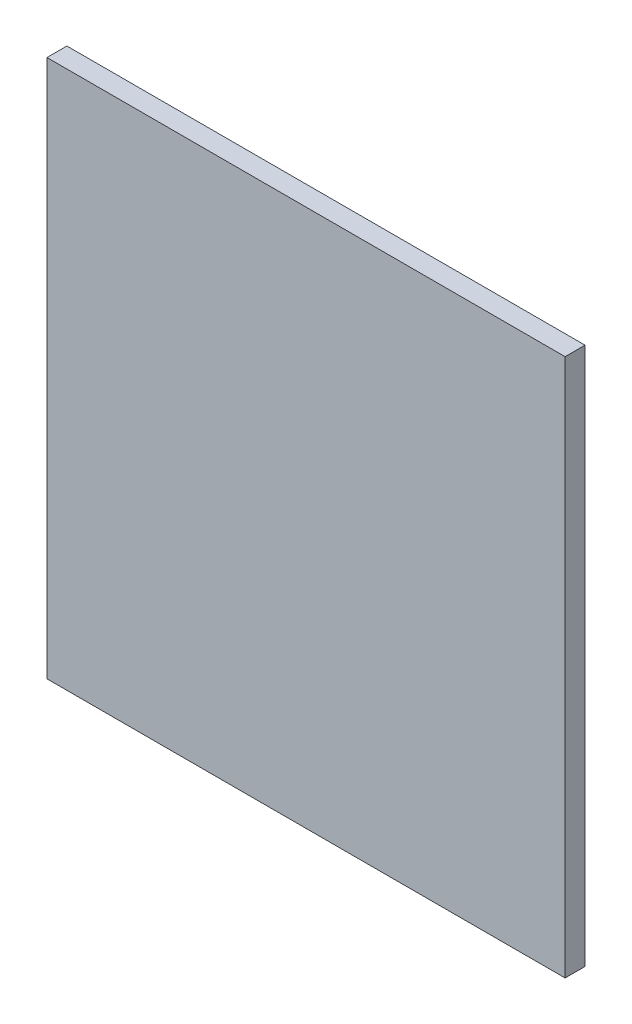
ISO-10303-21;
HEADER;
FILE_DESCRIPTION(('STEP AP214'),'2;1');
FILE_NAME('part.step','',(''),(''),'','','');
FILE_SCHEMA(('AUTOMOTIVE_DESIGN { 1 0 10303 214 1 1 1 1 }'));
ENDSEC;
DATA;
#1=APPLICATION_CONTEXT('core data for automotive mechanical design processes');
#2=APPLICATION_PROTOCOL_DEFINITION('international standard','automotive_design',2000,#1);
#3=PRODUCT_CONTEXT('',#1,'mechanical');
#4=PRODUCT('Part','Part','',(#3));
#5=PRODUCT_RELATED_PRODUCT_CATEGORY('part','',(#4));
#6=PRODUCT_DEFINITION_FORMATION('','',#4);
#7=PRODUCT_DEFINITION_CONTEXT('part definition',#1,'design');
#8=PRODUCT_DEFINITION('design','',#6,#7);
#9=PRODUCT_DEFINITION_SHAPE('','',#8);
#10=(LENGTH_UNIT() NAMED_UNIT(*) SI_UNIT(.MILLI.,.METRE.));
#11=(NAMED_UNIT(*) PLANE_ANGLE_UNIT() SI_UNIT($,.RADIAN.));
#12=(NAMED_UNIT(*) SI_UNIT($,.STERADIAN.) SOLID_ANGLE_UNIT());
#13=UNCERTAINTY_MEASURE_WITH_UNIT(LENGTH_MEASURE(1.E-05),#10,'distance_accuracy_value','');
#14=(GEOMETRIC_REPRESENTATION_CONTEXT(3) GLOBAL_UNCERTAINTY_ASSIGNED_CONTEXT((#13)) GLOBAL_UNIT_ASSIGNED_CONTEXT((#10,
#11,#12)) REPRESENTATION_CONTEXT('',''));
#15=CARTESIAN_POINT('',(0.,0.,0.));
#16=DIRECTION('',(0.,0.,1.));
#17=DIRECTION('',(1.,0.,0.));
#18=AXIS2_PLACEMENT_3D('',#15,#16,#17);
#19=CARTESIAN_POINT('',(158.75,155.575,6.35));
#20=DIRECTION('',(-1.,0.,0.));
#21=DIRECTION('',(0.,-1.,0.));
#22=AXIS2_PLACEMENT_3D('',#19,#20,#21);
#23=PLANE('',#22);
#24=DIRECTION('',(0.,1.,0.));
#25=VECTOR('',#24,1.);
#26=CARTESIAN_POINT('',(158.75,155.575,0.));
#27=LINE('',#26,#25);
#28=CARTESIAN_POINT('',(158.75,-15.875,0.));
#29=VERTEX_POINT('',#28);
#30=CARTESIAN_POINT('',(158.75,155.575,0.));
#31=VERTEX_POINT('',#30);
#32=EDGE_CURVE('E96',#29,#31,#27,.T.);
#33=ORIENTED_EDGE('',*,*,#32,.T.);
#34=DIRECTION('',(0.,0.,-1.));
#35=VECTOR('',#34,1.);
#36=CARTESIAN_POINT('',(158.75,155.575,6.35));
#37=LINE('',#36,#35);
#38=CARTESIAN_POINT('',(158.75,155.575,6.35));
#39=VERTEX_POINT('',#38);
#40=EDGE_CURVE('E11',#39,#31,#37,.T.);
#41=ORIENTED_EDGE('',*,*,#40,.F.);
#42=DIRECTION('',(0.,1.,0.));
#43=VECTOR('',#42,1.);
#44=CARTESIAN_POINT('',(158.75,155.575,6.35));
#45=LINE('',#44,#43);
#46=CARTESIAN_POINT('',(158.75,-15.875,6.35));
#47=VERTEX_POINT('',#46);
#48=EDGE_CURVE('E84',#47,#39,#45,.T.);
#49=ORIENTED_EDGE('',*,*,#48,.F.);
#50=DIRECTION('',(0.,0.,-1.));
#51=VECTOR('',#50,1.);
#52=CARTESIAN_POINT('',(158.75,-15.875,6.35));
#53=LINE('',#52,#51);
#54=EDGE_CURVE('E92',#47,#29,#53,.T.);
#55=ORIENTED_EDGE('',*,*,#54,.T.);
#56=EDGE_LOOP('',(#33,#41,#49,#55));
#57=FACE_BOUND('',#56,.T.);
#58=ADVANCED_FACE('F33',(#57),#23,.F.);
#59=CARTESIAN_POINT('',(158.75,155.575,6.35));
#60=DIRECTION('',(0.,-1.,0.));
#61=DIRECTION('',(0.,0.,-1.));
#62=AXIS2_PLACEMENT_3D('',#59,#60,#61);
#63=PLANE('',#62);
#64=DIRECTION('',(-1.,0.,0.));
#65=VECTOR('',#64,1.);
#66=CARTESIAN_POINT('',(158.75,155.575,0.));
#67=LINE('',#66,#65);
#68=CARTESIAN_POINT('',(-6.35000000000001,155.575,0.));
#69=VERTEX_POINT('',#68);
#70=EDGE_CURVE('E88',#31,#69,#67,.T.);
#71=ORIENTED_EDGE('',*,*,#70,.T.);
#72=DIRECTION('',(0.,0.,-1.));
#73=VECTOR('',#72,1.);
#74=CARTESIAN_POINT('',(-6.35000000000001,155.575,6.35));
#75=LINE('',#74,#73);
#76=CARTESIAN_POINT('',(-6.35000000000001,155.575,6.35));
#77=VERTEX_POINT('',#76);
#78=EDGE_CURVE('E41',#77,#69,#75,.T.);
#79=ORIENTED_EDGE('',*,*,#78,.F.);
#80=DIRECTION('',(-1.,0.,0.));
#81=VECTOR('',#80,1.);
#82=CARTESIAN_POINT('',(158.75,155.575,6.35));
#83=LINE('',#82,#81);
#84=EDGE_CURVE('E79',#39,#77,#83,.T.);
#85=ORIENTED_EDGE('',*,*,#84,.F.);
#86=ORIENTED_EDGE('',*,*,#40,.T.);
#87=EDGE_LOOP('',(#71,#79,#85,#86));
#88=FACE_BOUND('',#87,.T.);
#89=ADVANCED_FACE('F87',(#88),#63,.F.);
#90=CARTESIAN_POINT('',(-6.35000000000001,155.575,6.35));
#91=DIRECTION('',(1.,0.,0.));
#92=DIRECTION('',(0.,1.,0.));
#93=AXIS2_PLACEMENT_3D('',#90,#91,#92);
#94=PLANE('',#93);
#95=DIRECTION('',(0.,-1.,0.));
#96=VECTOR('',#95,1.);
#97=CARTESIAN_POINT('',(-6.35000000000001,155.575,0.));
#98=LINE('',#97,#96);
#99=CARTESIAN_POINT('',(-6.35000000000001,-15.875,0.));
#100=VERTEX_POINT('',#99);
#101=EDGE_CURVE('E66',#69,#100,#98,.T.);
#102=ORIENTED_EDGE('',*,*,#101,.T.);
#103=DIRECTION('',(0.,0.,-1.));
#104=VECTOR('',#103,1.);
#105=CARTESIAN_POINT('',(-6.35000000000001,-15.875,6.35));
#106=LINE('',#105,#104);
#107=CARTESIAN_POINT('',(-6.35000000000001,-15.875,6.35));
#108=VERTEX_POINT('',#107);
#109=EDGE_CURVE('E89',#108,#100,#106,.T.);
#110=ORIENTED_EDGE('',*,*,#109,.F.);
#111=DIRECTION('',(0.,-1.,0.));
#112=VECTOR('',#111,1.);
#113=CARTESIAN_POINT('',(-6.35000000000001,155.575,6.35));
#114=LINE('',#113,#112);
#115=EDGE_CURVE('E82',#77,#108,#114,.T.);
#116=ORIENTED_EDGE('',*,*,#115,.F.);
#117=ORIENTED_EDGE('',*,*,#78,.T.);
#118=EDGE_LOOP('',(#102,#110,#116,#117));
#119=FACE_BOUND('',#118,.T.);
#120=ADVANCED_FACE('F90',(#119),#94,.F.);
#121=CARTESIAN_POINT('',(158.75,-15.875,6.35));
#122=DIRECTION('',(0.,1.,0.));
#123=DIRECTION('',(-1.,0.,0.));
#124=AXIS2_PLACEMENT_3D('',#121,#122,#123);
#125=PLANE('',#124);
#126=DIRECTION('',(1.,0.,0.));
#127=VECTOR('',#126,1.);
#128=CARTESIAN_POINT('',(158.75,-15.875,0.));
#129=LINE('',#128,#127);
#130=EDGE_CURVE('E72',#100,#29,#129,.T.);
#131=ORIENTED_EDGE('',*,*,#130,.T.);
#132=ORIENTED_EDGE('',*,*,#54,.F.);
#133=DIRECTION('',(1.,0.,0.));
#134=VECTOR('',#133,1.);
#135=CARTESIAN_POINT('',(158.75,-15.875,6.35));
#136=LINE('',#135,#134);
#137=EDGE_CURVE('E49',#108,#47,#136,.T.);
#138=ORIENTED_EDGE('',*,*,#137,.F.);
#139=ORIENTED_EDGE('',*,*,#109,.T.);
#140=EDGE_LOOP('',(#131,#132,#138,#139));
#141=FACE_BOUND('',#140,.T.);
#142=ADVANCED_FACE('F103',(#141),#125,.F.);
#143=CARTESIAN_POINT('',(0.,0.,6.35));
#144=DIRECTION('',(0.,0.,-1.));
#145=DIRECTION('',(-1.,0.,0.));
#146=AXIS2_PLACEMENT_3D('',#143,#144,#145);
#147=PLANE('',#146);
#148=ORIENTED_EDGE('',*,*,#48,.T.);
#149=ORIENTED_EDGE('',*,*,#84,.T.);
#150=ORIENTED_EDGE('',*,*,#115,.T.);
#151=ORIENTED_EDGE('',*,*,#137,.T.);
#152=EDGE_LOOP('',(#148,#149,#150,#151));
#153=FACE_BOUND('',#152,.T.);
#154=ADVANCED_FACE('F80',(#153),#147,.F.);
#155=CARTESIAN_POINT('',(0.,0.,0.));
#156=DIRECTION('',(0.,0.,-1.));
#157=DIRECTION('',(-1.,0.,0.));
#158=AXIS2_PLACEMENT_3D('',#155,#156,#157);
#159=PLANE('',#158);
#160=ORIENTED_EDGE('',*,*,#32,.F.);
#161=ORIENTED_EDGE('',*,*,#130,.F.);
#162=ORIENTED_EDGE('',*,*,#101,.F.);
#163=ORIENTED_EDGE('',*,*,#70,.F.);
#164=EDGE_LOOP('',(#160,#161,#162,#163));
#165=FACE_BOUND('',#164,.T.);
#166=ADVANCED_FACE('F106',(#165),#159,.T.);
#167=CLOSED_SHELL('',(#58,#89,#120,#142,#154,#166));
#168=MANIFOLD_SOLID_BREP('B2',#167);
#169=ADVANCED_BREP_SHAPE_REPRESENTATION('',(#18,#168),#14);
#170=SHAPE_DEFINITION_REPRESENTATION(#9,#169);
ENDSEC;
END-ISO-10303-21;
